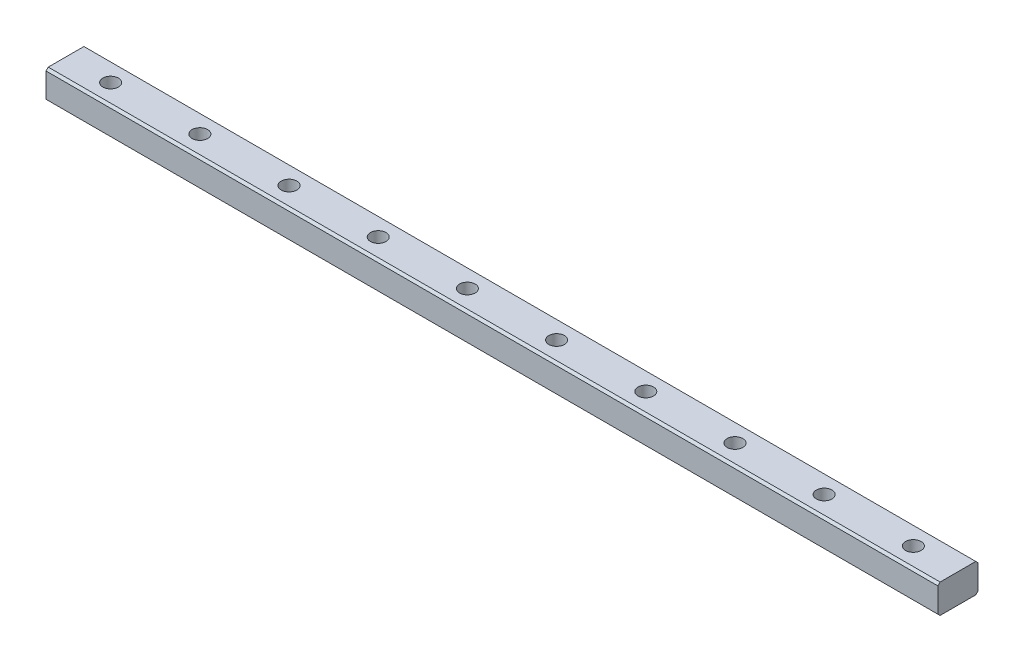
ISO-10303-21;
HEADER;
FILE_DESCRIPTION(('STEP AP214'),'2;1');
FILE_NAME('part.step','',(''),(''),'','','');
FILE_SCHEMA(('AUTOMOTIVE_DESIGN { 1 0 10303 214 1 1 1 1 }'));
ENDSEC;
DATA;
#1=APPLICATION_CONTEXT('core data for automotive mechanical design processes');
#2=APPLICATION_PROTOCOL_DEFINITION('international standard','automotive_design',2000,#1);
#3=PRODUCT_CONTEXT('',#1,'mechanical');
#4=PRODUCT('Part','Part','',(#3));
#5=PRODUCT_RELATED_PRODUCT_CATEGORY('part','',(#4));
#6=PRODUCT_DEFINITION_FORMATION('','',#4);
#7=PRODUCT_DEFINITION_CONTEXT('part definition',#1,'design');
#8=PRODUCT_DEFINITION('design','',#6,#7);
#9=PRODUCT_DEFINITION_SHAPE('','',#8);
#10=(LENGTH_UNIT() NAMED_UNIT(*) SI_UNIT(.MILLI.,.METRE.));
#11=(NAMED_UNIT(*) PLANE_ANGLE_UNIT() SI_UNIT($,.RADIAN.));
#12=(NAMED_UNIT(*) SI_UNIT($,.STERADIAN.) SOLID_ANGLE_UNIT());
#13=UNCERTAINTY_MEASURE_WITH_UNIT(LENGTH_MEASURE(1.E-05),#10,'distance_accuracy_value','');
#14=(GEOMETRIC_REPRESENTATION_CONTEXT(3) GLOBAL_UNCERTAINTY_ASSIGNED_CONTEXT((#13)) GLOBAL_UNIT_ASSIGNED_CONTEXT((#10,
#11,#12)) REPRESENTATION_CONTEXT('',''));
#15=CARTESIAN_POINT('',(0.,0.,0.));
#16=DIRECTION('',(0.,0.,1.));
#17=DIRECTION('',(1.,0.,0.));
#18=AXIS2_PLACEMENT_3D('',#15,#16,#17);
#19=CARTESIAN_POINT('',(149.999999999999,4.75,0.));
#20=DIRECTION('',(0.,-1.,0.));
#21=DIRECTION('',(0.,0.,-1.));
#22=AXIS2_PLACEMENT_3D('',#19,#20,#21);
#23=CYLINDRICAL_SURFACE('',#22,1.74999999999998);
#24=CARTESIAN_POINT('',(149.999999999999,3.25,0.));
#25=DIRECTION('',(0.,-1.,0.));
#26=DIRECTION('',(0.,0.,-1.));
#27=AXIS2_PLACEMENT_3D('',#24,#25,#26);
#28=CIRCLE('',#27,1.74999999999998);
#29=CARTESIAN_POINT('',(149.999999999999,3.25,-1.74999999999998));
#30=VERTEX_POINT('',#29);
#31=EDGE_CURVE('E169',#30,#30,#28,.T.);
#32=ORIENTED_EDGE('',*,*,#31,.F.);
#33=EDGE_LOOP('',(#32));
#34=FACE_BOUND('',#33,.T.);
#35=CARTESIAN_POINT('',(149.999999999999,0.25,0.));
#36=DIRECTION('',(0.,-1.,0.));
#37=DIRECTION('',(0.,0.,-1.));
#38=AXIS2_PLACEMENT_3D('',#35,#36,#37);
#39=CIRCLE('',#38,1.74999999999998);
#40=CARTESIAN_POINT('',(149.999999999999,0.25,-1.74999999999998));
#41=VERTEX_POINT('',#40);
#42=EDGE_CURVE('E216',#41,#41,#39,.F.);
#43=ORIENTED_EDGE('',*,*,#42,.F.);
#44=EDGE_LOOP('',(#43));
#45=FACE_BOUND('',#44,.T.);
#46=ADVANCED_FACE('F39',(#34,#45),#23,.F.);
#47=CARTESIAN_POINT('',(129.999999999999,4.75,0.));
#48=DIRECTION('',(0.,-1.,0.));
#49=DIRECTION('',(0.,0.,-1.));
#50=AXIS2_PLACEMENT_3D('',#47,#48,#49);
#51=CYLINDRICAL_SURFACE('',#50,1.74999999999998);
#52=CARTESIAN_POINT('',(129.999999999999,3.25,0.));
#53=DIRECTION('',(0.,-1.,0.));
#54=DIRECTION('',(0.,0.,-1.));
#55=AXIS2_PLACEMENT_3D('',#52,#53,#54);
#56=CIRCLE('',#55,1.74999999999998);
#57=CARTESIAN_POINT('',(129.999999999999,3.25,-1.74999999999998));
#58=VERTEX_POINT('',#57);
#59=EDGE_CURVE('E166',#58,#58,#56,.T.);
#60=ORIENTED_EDGE('',*,*,#59,.F.);
#61=EDGE_LOOP('',(#60));
#62=FACE_BOUND('',#61,.T.);
#63=CARTESIAN_POINT('',(129.999999999999,0.25,0.));
#64=DIRECTION('',(0.,-1.,0.));
#65=DIRECTION('',(0.,0.,-1.));
#66=AXIS2_PLACEMENT_3D('',#63,#64,#65);
#67=CIRCLE('',#66,1.74999999999998);
#68=CARTESIAN_POINT('',(129.999999999999,0.25,-1.74999999999998));
#69=VERTEX_POINT('',#68);
#70=EDGE_CURVE('E211',#69,#69,#67,.F.);
#71=ORIENTED_EDGE('',*,*,#70,.F.);
#72=EDGE_LOOP('',(#71));
#73=FACE_BOUND('',#72,.T.);
#74=ADVANCED_FACE('F351',(#62,#73),#51,.F.);
#75=CARTESIAN_POINT('',(110.,4.75,0.));
#76=DIRECTION('',(0.,-1.,0.));
#77=DIRECTION('',(0.,0.,-1.));
#78=AXIS2_PLACEMENT_3D('',#75,#76,#77);
#79=CYLINDRICAL_SURFACE('',#78,1.75);
#80=CARTESIAN_POINT('',(110.,3.25,0.));
#81=DIRECTION('',(0.,-1.,0.));
#82=DIRECTION('',(0.,0.,-1.));
#83=AXIS2_PLACEMENT_3D('',#80,#81,#82);
#84=CIRCLE('',#83,1.75);
#85=CARTESIAN_POINT('',(110.,3.25,-1.75));
#86=VERTEX_POINT('',#85);
#87=EDGE_CURVE('E163',#86,#86,#84,.T.);
#88=ORIENTED_EDGE('',*,*,#87,.F.);
#89=EDGE_LOOP('',(#88));
#90=FACE_BOUND('',#89,.T.);
#91=CARTESIAN_POINT('',(110.,0.25,0.));
#92=DIRECTION('',(0.,-1.,0.));
#93=DIRECTION('',(0.,0.,-1.));
#94=AXIS2_PLACEMENT_3D('',#91,#92,#93);
#95=CIRCLE('',#94,1.75);
#96=CARTESIAN_POINT('',(110.,0.25,-1.75));
#97=VERTEX_POINT('',#96);
#98=EDGE_CURVE('E206',#97,#97,#95,.F.);
#99=ORIENTED_EDGE('',*,*,#98,.F.);
#100=EDGE_LOOP('',(#99));
#101=FACE_BOUND('',#100,.T.);
#102=ADVANCED_FACE('F356',(#90,#101),#79,.F.);
#103=CARTESIAN_POINT('',(89.9999999999996,4.75,0.));
#104=DIRECTION('',(0.,-1.,0.));
#105=DIRECTION('',(0.,0.,-1.));
#106=AXIS2_PLACEMENT_3D('',#103,#104,#105);
#107=CYLINDRICAL_SURFACE('',#106,1.75);
#108=CARTESIAN_POINT('',(89.9999999999996,3.25,0.));
#109=DIRECTION('',(0.,-1.,0.));
#110=DIRECTION('',(0.,0.,-1.));
#111=AXIS2_PLACEMENT_3D('',#108,#109,#110);
#112=CIRCLE('',#111,1.75);
#113=CARTESIAN_POINT('',(89.9999999999996,3.25,-1.75));
#114=VERTEX_POINT('',#113);
#115=EDGE_CURVE('E160',#114,#114,#112,.T.);
#116=ORIENTED_EDGE('',*,*,#115,.F.);
#117=EDGE_LOOP('',(#116));
#118=FACE_BOUND('',#117,.T.);
#119=CARTESIAN_POINT('',(89.9999999999996,0.25,0.));
#120=DIRECTION('',(0.,-1.,0.));
#121=DIRECTION('',(0.,0.,-1.));
#122=AXIS2_PLACEMENT_3D('',#119,#120,#121);
#123=CIRCLE('',#122,1.75);
#124=CARTESIAN_POINT('',(89.9999999999996,0.25,-1.75));
#125=VERTEX_POINT('',#124);
#126=EDGE_CURVE('E201',#125,#125,#123,.F.);
#127=ORIENTED_EDGE('',*,*,#126,.F.);
#128=EDGE_LOOP('',(#127));
#129=FACE_BOUND('',#128,.T.);
#130=ADVANCED_FACE('F364',(#118,#129),#107,.F.);
#131=CARTESIAN_POINT('',(69.9999999999997,4.75,0.));
#132=DIRECTION('',(0.,-1.,0.));
#133=DIRECTION('',(0.,0.,-1.));
#134=AXIS2_PLACEMENT_3D('',#131,#132,#133);
#135=CYLINDRICAL_SURFACE('',#134,1.75);
#136=CARTESIAN_POINT('',(69.9999999999997,3.25,0.));
#137=DIRECTION('',(0.,-1.,0.));
#138=DIRECTION('',(0.,0.,-1.));
#139=AXIS2_PLACEMENT_3D('',#136,#137,#138);
#140=CIRCLE('',#139,1.75);
#141=CARTESIAN_POINT('',(69.9999999999997,3.25,-1.75));
#142=VERTEX_POINT('',#141);
#143=EDGE_CURVE('E157',#142,#142,#140,.T.);
#144=ORIENTED_EDGE('',*,*,#143,.F.);
#145=EDGE_LOOP('',(#144));
#146=FACE_BOUND('',#145,.T.);
#147=CARTESIAN_POINT('',(69.9999999999997,0.25,0.));
#148=DIRECTION('',(0.,-1.,0.));
#149=DIRECTION('',(0.,0.,-1.));
#150=AXIS2_PLACEMENT_3D('',#147,#148,#149);
#151=CIRCLE('',#150,1.75);
#152=CARTESIAN_POINT('',(69.9999999999997,0.25,-1.75));
#153=VERTEX_POINT('',#152);
#154=EDGE_CURVE('E196',#153,#153,#151,.F.);
#155=ORIENTED_EDGE('',*,*,#154,.F.);
#156=EDGE_LOOP('',(#155));
#157=FACE_BOUND('',#156,.T.);
#158=ADVANCED_FACE('F368',(#146,#157),#135,.F.);
#159=CARTESIAN_POINT('',(49.9999999999998,4.75,0.));
#160=DIRECTION('',(0.,-1.,0.));
#161=DIRECTION('',(0.,0.,-1.));
#162=AXIS2_PLACEMENT_3D('',#159,#160,#161);
#163=CYLINDRICAL_SURFACE('',#162,1.75);
#164=CARTESIAN_POINT('',(49.9999999999998,3.25,0.));
#165=DIRECTION('',(0.,-1.,0.));
#166=DIRECTION('',(0.,0.,-1.));
#167=AXIS2_PLACEMENT_3D('',#164,#165,#166);
#168=CIRCLE('',#167,1.75);
#169=CARTESIAN_POINT('',(49.9999999999998,3.25,-1.75000000000001));
#170=VERTEX_POINT('',#169);
#171=EDGE_CURVE('E154',#170,#170,#168,.T.);
#172=ORIENTED_EDGE('',*,*,#171,.F.);
#173=EDGE_LOOP('',(#172));
#174=FACE_BOUND('',#173,.T.);
#175=CARTESIAN_POINT('',(49.9999999999998,0.25,0.));
#176=DIRECTION('',(0.,-1.,0.));
#177=DIRECTION('',(0.,0.,-1.));
#178=AXIS2_PLACEMENT_3D('',#175,#176,#177);
#179=CIRCLE('',#178,1.75);
#180=CARTESIAN_POINT('',(49.9999999999998,0.25,-1.75000000000001));
#181=VERTEX_POINT('',#180);
#182=EDGE_CURVE('E191',#181,#181,#179,.F.);
#183=ORIENTED_EDGE('',*,*,#182,.F.);
#184=EDGE_LOOP('',(#183));
#185=FACE_BOUND('',#184,.T.);
#186=ADVANCED_FACE('F372',(#174,#185),#163,.F.);
#187=CARTESIAN_POINT('',(29.9999999999999,4.75,0.));
#188=DIRECTION('',(0.,-1.,0.));
#189=DIRECTION('',(0.,0.,-1.));
#190=AXIS2_PLACEMENT_3D('',#187,#188,#189);
#191=CYLINDRICAL_SURFACE('',#190,1.75);
#192=CARTESIAN_POINT('',(29.9999999999999,3.25,0.));
#193=DIRECTION('',(0.,-1.,0.));
#194=DIRECTION('',(0.,0.,-1.));
#195=AXIS2_PLACEMENT_3D('',#192,#193,#194);
#196=CIRCLE('',#195,1.75);
#197=CARTESIAN_POINT('',(29.9999999999999,3.25,-1.75000000000001));
#198=VERTEX_POINT('',#197);
#199=EDGE_CURVE('E151',#198,#198,#196,.T.);
#200=ORIENTED_EDGE('',*,*,#199,.F.);
#201=EDGE_LOOP('',(#200));
#202=FACE_BOUND('',#201,.T.);
#203=CARTESIAN_POINT('',(29.9999999999999,0.25,0.));
#204=DIRECTION('',(0.,-1.,0.));
#205=DIRECTION('',(0.,0.,-1.));
#206=AXIS2_PLACEMENT_3D('',#203,#204,#205);
#207=CIRCLE('',#206,1.75);
#208=CARTESIAN_POINT('',(29.9999999999999,0.25,-1.75000000000001));
#209=VERTEX_POINT('',#208);
#210=EDGE_CURVE('E186',#209,#209,#207,.F.);
#211=ORIENTED_EDGE('',*,*,#210,.F.);
#212=EDGE_LOOP('',(#211));
#213=FACE_BOUND('',#212,.T.);
#214=ADVANCED_FACE('F376',(#202,#213),#191,.F.);
#215=CARTESIAN_POINT('',(189.999999999999,4.75,0.));
#216=DIRECTION('',(0.,-1.,0.));
#217=DIRECTION('',(0.,0.,-1.));
#218=AXIS2_PLACEMENT_3D('',#215,#216,#217);
#219=CYLINDRICAL_SURFACE('',#218,1.74999999999998);
#220=CARTESIAN_POINT('',(189.999999999999,3.25,0.));
#221=DIRECTION('',(0.,-1.,0.));
#222=DIRECTION('',(0.,0.,-1.));
#223=AXIS2_PLACEMENT_3D('',#220,#221,#222);
#224=CIRCLE('',#223,1.74999999999998);
#225=CARTESIAN_POINT('',(189.999999999999,3.25,-1.74999999999998));
#226=VERTEX_POINT('',#225);
#227=EDGE_CURVE('E148',#226,#226,#224,.T.);
#228=ORIENTED_EDGE('',*,*,#227,.F.);
#229=EDGE_LOOP('',(#228));
#230=FACE_BOUND('',#229,.T.);
#231=CARTESIAN_POINT('',(189.999999999999,0.25,0.));
#232=DIRECTION('',(0.,-1.,0.));
#233=DIRECTION('',(0.,0.,-1.));
#234=AXIS2_PLACEMENT_3D('',#231,#232,#233);
#235=CIRCLE('',#234,1.74999999999998);
#236=CARTESIAN_POINT('',(189.999999999999,0.25,-1.74999999999998));
#237=VERTEX_POINT('',#236);
#238=EDGE_CURVE('E181',#237,#237,#235,.F.);
#239=ORIENTED_EDGE('',*,*,#238,.F.);
#240=EDGE_LOOP('',(#239));
#241=FACE_BOUND('',#240,.T.);
#242=ADVANCED_FACE('F380',(#230,#241),#219,.F.);
#243=CARTESIAN_POINT('',(169.999999999999,4.75,0.));
#244=DIRECTION('',(0.,-1.,0.));
#245=DIRECTION('',(0.,0.,-1.));
#246=AXIS2_PLACEMENT_3D('',#243,#244,#245);
#247=CYLINDRICAL_SURFACE('',#246,1.74999999999998);
#248=CARTESIAN_POINT('',(169.999999999999,3.25,0.));
#249=DIRECTION('',(0.,-1.,0.));
#250=DIRECTION('',(0.,0.,-1.));
#251=AXIS2_PLACEMENT_3D('',#248,#249,#250);
#252=CIRCLE('',#251,1.74999999999998);
#253=CARTESIAN_POINT('',(169.999999999999,3.25,-1.74999999999998));
#254=VERTEX_POINT('',#253);
#255=EDGE_CURVE('E145',#254,#254,#252,.T.);
#256=ORIENTED_EDGE('',*,*,#255,.F.);
#257=EDGE_LOOP('',(#256));
#258=FACE_BOUND('',#257,.T.);
#259=CARTESIAN_POINT('',(169.999999999999,0.25,0.));
#260=DIRECTION('',(0.,-1.,0.));
#261=DIRECTION('',(0.,0.,-1.));
#262=AXIS2_PLACEMENT_3D('',#259,#260,#261);
#263=CIRCLE('',#262,1.74999999999998);
#264=CARTESIAN_POINT('',(169.999999999999,0.25,-1.74999999999998));
#265=VERTEX_POINT('',#264);
#266=EDGE_CURVE('E176',#265,#265,#263,.F.);
#267=ORIENTED_EDGE('',*,*,#266,.F.);
#268=EDGE_LOOP('',(#267));
#269=FACE_BOUND('',#268,.T.);
#270=ADVANCED_FACE('F384',(#258,#269),#247,.F.);
#271=CARTESIAN_POINT('',(10.,4.75,0.));
#272=DIRECTION('',(0.,-1.,0.));
#273=DIRECTION('',(0.,0.,-1.));
#274=AXIS2_PLACEMENT_3D('',#271,#272,#273);
#275=CYLINDRICAL_SURFACE('',#274,1.75);
#276=CARTESIAN_POINT('',(10.,3.25,0.));
#277=DIRECTION('',(0.,-1.,0.));
#278=DIRECTION('',(0.,0.,-1.));
#279=AXIS2_PLACEMENT_3D('',#276,#277,#278);
#280=CIRCLE('',#279,1.75);
#281=CARTESIAN_POINT('',(10.,3.25,-1.75));
#282=VERTEX_POINT('',#281);
#283=EDGE_CURVE('E137',#282,#282,#280,.T.);
#284=ORIENTED_EDGE('',*,*,#283,.F.);
#285=EDGE_LOOP('',(#284));
#286=FACE_BOUND('',#285,.T.);
#287=CARTESIAN_POINT('',(10.,0.25,0.));
#288=DIRECTION('',(0.,-1.,0.));
#289=DIRECTION('',(0.,0.,-1.));
#290=AXIS2_PLACEMENT_3D('',#287,#288,#289);
#291=CIRCLE('',#290,1.75);
#292=CARTESIAN_POINT('',(10.,0.25,-1.75));
#293=VERTEX_POINT('',#292);
#294=EDGE_CURVE('E172',#293,#293,#291,.F.);
#295=ORIENTED_EDGE('',*,*,#294,.F.);
#296=EDGE_LOOP('',(#295));
#297=FACE_BOUND('',#296,.T.);
#298=ADVANCED_FACE('F388',(#286,#297),#275,.F.);
#299=CARTESIAN_POINT('',(200.,-3.25,4.5));
#300=DIRECTION('',(0.,0.,-1.));
#301=DIRECTION('',(-1.,0.,0.));
#302=AXIS2_PLACEMENT_3D('',#299,#300,#301);
#303=PLANE('',#302);
#304=DIRECTION('',(0.,-1.,0.));
#305=VECTOR('',#304,1.);
#306=CARTESIAN_POINT('',(0.,-3.25,4.5));
#307=LINE('',#306,#305);
#308=CARTESIAN_POINT('',(0.,2.75000000000003,4.5));
#309=VERTEX_POINT('',#308);
#310=CARTESIAN_POINT('',(0.,-2.75,4.5));
#311=VERTEX_POINT('',#310);
#312=EDGE_CURVE('E132',#309,#311,#307,.T.);
#313=ORIENTED_EDGE('',*,*,#312,.T.);
#314=DIRECTION('',(1.,0.,0.));
#315=VECTOR('',#314,1.);
#316=CARTESIAN_POINT('',(200.,-2.75,4.5));
#317=LINE('',#316,#315);
#318=CARTESIAN_POINT('',(200.,-2.75,4.5));
#319=VERTEX_POINT('',#318);
#320=EDGE_CURVE('E110',#311,#319,#317,.T.);
#321=ORIENTED_EDGE('',*,*,#320,.T.);
#322=DIRECTION('',(0.,-1.,0.));
#323=VECTOR('',#322,1.);
#324=CARTESIAN_POINT('',(200.,-3.25,4.5));
#325=LINE('',#324,#323);
#326=CARTESIAN_POINT('',(200.,2.75000000000003,4.5));
#327=VERTEX_POINT('',#326);
#328=EDGE_CURVE('E142',#327,#319,#325,.T.);
#329=ORIENTED_EDGE('',*,*,#328,.F.);
#330=DIRECTION('',(-1.,0.,0.));
#331=VECTOR('',#330,1.);
#332=CARTESIAN_POINT('',(200.,2.75000000000003,4.5));
#333=LINE('',#332,#331);
#334=EDGE_CURVE('E115',#327,#309,#333,.T.);
#335=ORIENTED_EDGE('',*,*,#334,.T.);
#336=EDGE_LOOP('',(#313,#321,#329,#335));
#337=FACE_BOUND('',#336,.T.);
#338=ADVANCED_FACE('F313',(#337),#303,.F.);
#339=CARTESIAN_POINT('',(200.,-3.25,-4.5));
#340=DIRECTION('',(0.,1.,0.));
#341=DIRECTION('',(0.,0.,1.));
#342=AXIS2_PLACEMENT_3D('',#339,#340,#341);
#343=PLANE('',#342);
#344=CARTESIAN_POINT('',(150.,-3.25,0.));
#345=DIRECTION('',(0.,-1.,0.));
#346=DIRECTION('',(0.,0.,-1.));
#347=AXIS2_PLACEMENT_3D('',#344,#345,#346);
#348=CIRCLE('',#347,2.99999999999999);
#349=CARTESIAN_POINT('',(150.,-3.25,-3.));
#350=VERTEX_POINT('',#349);
#351=EDGE_CURVE('E296',#350,#350,#348,.T.);
#352=ORIENTED_EDGE('',*,*,#351,.F.);
#353=EDGE_LOOP('',(#352));
#354=FACE_BOUND('',#353,.T.);
#355=CARTESIAN_POINT('',(130.,-3.25,0.));
#356=DIRECTION('',(0.,-1.,0.));
#357=DIRECTION('',(0.,0.,-1.));
#358=AXIS2_PLACEMENT_3D('',#355,#356,#357);
#359=CIRCLE('',#358,2.99999999999999);
#360=CARTESIAN_POINT('',(130.,-3.25,-3.));
#361=VERTEX_POINT('',#360);
#362=EDGE_CURVE('E219',#361,#361,#359,.T.);
#363=ORIENTED_EDGE('',*,*,#362,.F.);
#364=EDGE_LOOP('',(#363));
#365=FACE_BOUND('',#364,.T.);
#366=CARTESIAN_POINT('',(110.,-3.25,0.));
#367=DIRECTION('',(0.,-1.,0.));
#368=DIRECTION('',(0.,0.,-1.));
#369=AXIS2_PLACEMENT_3D('',#366,#367,#368);
#370=CIRCLE('',#369,2.99999999999999);
#371=CARTESIAN_POINT('',(110.,-3.25,-2.99999999999999));
#372=VERTEX_POINT('',#371);
#373=EDGE_CURVE('E214',#372,#372,#370,.T.);
#374=ORIENTED_EDGE('',*,*,#373,.F.);
#375=EDGE_LOOP('',(#374));
#376=FACE_BOUND('',#375,.T.);
#377=CARTESIAN_POINT('',(90.,-3.25,0.));
#378=DIRECTION('',(0.,-1.,0.));
#379=DIRECTION('',(0.,0.,-1.));
#380=AXIS2_PLACEMENT_3D('',#377,#378,#379);
#381=CIRCLE('',#380,3.00000000000001);
#382=CARTESIAN_POINT('',(90.,-3.25,-3.00000000000001));
#383=VERTEX_POINT('',#382);
#384=EDGE_CURVE('E209',#383,#383,#381,.T.);
#385=ORIENTED_EDGE('',*,*,#384,.F.);
#386=EDGE_LOOP('',(#385));
#387=FACE_BOUND('',#386,.T.);
#388=CARTESIAN_POINT('',(70.,-3.25,0.));
#389=DIRECTION('',(0.,-1.,0.));
#390=DIRECTION('',(0.,0.,-1.));
#391=AXIS2_PLACEMENT_3D('',#388,#389,#390);
#392=CIRCLE('',#391,2.99999999999999);
#393=CARTESIAN_POINT('',(70.,-3.25,-2.99999999999999));
#394=VERTEX_POINT('',#393);
#395=EDGE_CURVE('E204',#394,#394,#392,.T.);
#396=ORIENTED_EDGE('',*,*,#395,.F.);
#397=EDGE_LOOP('',(#396));
#398=FACE_BOUND('',#397,.T.);
#399=CARTESIAN_POINT('',(50.,-3.25,0.));
#400=DIRECTION('',(0.,-1.,0.));
#401=DIRECTION('',(0.,0.,-1.));
#402=AXIS2_PLACEMENT_3D('',#399,#400,#401);
#403=CIRCLE('',#402,3.);
#404=CARTESIAN_POINT('',(50.,-3.25,-3.));
#405=VERTEX_POINT('',#404);
#406=EDGE_CURVE('E199',#405,#405,#403,.T.);
#407=ORIENTED_EDGE('',*,*,#406,.F.);
#408=EDGE_LOOP('',(#407));
#409=FACE_BOUND('',#408,.T.);
#410=CARTESIAN_POINT('',(30.,-3.25,0.));
#411=DIRECTION('',(0.,-1.,0.));
#412=DIRECTION('',(0.,0.,-1.));
#413=AXIS2_PLACEMENT_3D('',#410,#411,#412);
#414=CIRCLE('',#413,3.);
#415=CARTESIAN_POINT('',(30.,-3.25,-3.));
#416=VERTEX_POINT('',#415);
#417=EDGE_CURVE('E194',#416,#416,#414,.T.);
#418=ORIENTED_EDGE('',*,*,#417,.F.);
#419=EDGE_LOOP('',(#418));
#420=FACE_BOUND('',#419,.T.);
#421=CARTESIAN_POINT('',(190.,-3.25,0.));
#422=DIRECTION('',(0.,-1.,0.));
#423=DIRECTION('',(0.,0.,-1.));
#424=AXIS2_PLACEMENT_3D('',#421,#422,#423);
#425=CIRCLE('',#424,2.99999999999999);
#426=CARTESIAN_POINT('',(190.,-3.25,-3.));
#427=VERTEX_POINT('',#426);
#428=EDGE_CURVE('E189',#427,#427,#425,.T.);
#429=ORIENTED_EDGE('',*,*,#428,.F.);
#430=EDGE_LOOP('',(#429));
#431=FACE_BOUND('',#430,.T.);
#432=CARTESIAN_POINT('',(170.,-3.25,0.));
#433=DIRECTION('',(0.,-1.,0.));
#434=DIRECTION('',(0.,0.,-1.));
#435=AXIS2_PLACEMENT_3D('',#432,#433,#434);
#436=CIRCLE('',#435,2.99999999999999);
#437=CARTESIAN_POINT('',(170.,-3.25,-3.));
#438=VERTEX_POINT('',#437);
#439=EDGE_CURVE('E184',#438,#438,#436,.T.);
#440=ORIENTED_EDGE('',*,*,#439,.F.);
#441=EDGE_LOOP('',(#440));
#442=FACE_BOUND('',#441,.T.);
#443=CARTESIAN_POINT('',(10.,-3.25,0.));
#444=DIRECTION('',(0.,-1.,0.));
#445=DIRECTION('',(0.,0.,-1.));
#446=AXIS2_PLACEMENT_3D('',#443,#444,#445);
#447=CIRCLE('',#446,3.);
#448=CARTESIAN_POINT('',(10.,-3.25,-3.));
#449=VERTEX_POINT('',#448);
#450=EDGE_CURVE('E179',#449,#449,#447,.T.);
#451=ORIENTED_EDGE('',*,*,#450,.F.);
#452=EDGE_LOOP('',(#451));
#453=FACE_BOUND('',#452,.T.);
#454=DIRECTION('',(0.,0.,-1.));
#455=VECTOR('',#454,1.);
#456=CARTESIAN_POINT('',(200.,-3.25,-4.5));
#457=LINE('',#456,#455);
#458=CARTESIAN_POINT('',(200.,-3.25,3.99999999999997));
#459=VERTEX_POINT('',#458);
#460=CARTESIAN_POINT('',(200.,-3.25,-4.));
#461=VERTEX_POINT('',#460);
#462=EDGE_CURVE('E125',#459,#461,#457,.T.);
#463=ORIENTED_EDGE('',*,*,#462,.F.);
#464=DIRECTION('',(-1.,0.,0.));
#465=VECTOR('',#464,1.);
#466=CARTESIAN_POINT('',(200.,-3.25,3.99999999999997));
#467=LINE('',#466,#465);
#468=CARTESIAN_POINT('',(0.,-3.25,3.99999999999997));
#469=VERTEX_POINT('',#468);
#470=EDGE_CURVE('E109',#459,#469,#467,.T.);
#471=ORIENTED_EDGE('',*,*,#470,.T.);
#472=DIRECTION('',(0.,0.,-1.));
#473=VECTOR('',#472,1.);
#474=CARTESIAN_POINT('',(0.,-3.25,-4.5));
#475=LINE('',#474,#473);
#476=CARTESIAN_POINT('',(0.,-3.25,-4.));
#477=VERTEX_POINT('',#476);
#478=EDGE_CURVE('E122',#469,#477,#475,.T.);
#479=ORIENTED_EDGE('',*,*,#478,.T.);
#480=DIRECTION('',(1.,0.,0.));
#481=VECTOR('',#480,1.);
#482=CARTESIAN_POINT('',(200.,-3.25,-4.));
#483=LINE('',#482,#481);
#484=EDGE_CURVE('E127',#477,#461,#483,.T.);
#485=ORIENTED_EDGE('',*,*,#484,.T.);
#486=EDGE_LOOP('',(#463,#471,#479,#485));
#487=FACE_BOUND('',#486,.T.);
#488=ADVANCED_FACE('F121',(#354,#365,#376,#387,#398,#409,#420,#431,#442,#453,#487),#343,.F.);
#489=CARTESIAN_POINT('',(200.,-3.25,-4.5));
#490=DIRECTION('',(0.,0.,1.));
#491=DIRECTION('',(1.,0.,0.));
#492=AXIS2_PLACEMENT_3D('',#489,#490,#491);
#493=PLANE('',#492);
#494=DIRECTION('',(0.,1.,0.));
#495=VECTOR('',#494,1.);
#496=CARTESIAN_POINT('',(0.,-3.25,-4.5));
#497=LINE('',#496,#495);
#498=CARTESIAN_POINT('',(0.,-2.75000000000003,-4.5));
#499=VERTEX_POINT('',#498);
#500=CARTESIAN_POINT('',(0.,2.75000000000003,-4.5));
#501=VERTEX_POINT('',#500);
#502=EDGE_CURVE('E131',#499,#501,#497,.T.);
#503=ORIENTED_EDGE('',*,*,#502,.T.);
#504=DIRECTION('',(1.,0.,0.));
#505=VECTOR('',#504,1.);
#506=CARTESIAN_POINT('',(200.,2.75000000000003,-4.5));
#507=LINE('',#506,#505);
#508=CARTESIAN_POINT('',(200.,2.75000000000003,-4.5));
#509=VERTEX_POINT('',#508);
#510=EDGE_CURVE('E11',#501,#509,#507,.T.);
#511=ORIENTED_EDGE('',*,*,#510,.T.);
#512=DIRECTION('',(0.,1.,0.));
#513=VECTOR('',#512,1.);
#514=CARTESIAN_POINT('',(200.,-3.25,-4.5));
#515=LINE('',#514,#513);
#516=CARTESIAN_POINT('',(200.,-2.75000000000003,-4.5));
#517=VERTEX_POINT('',#516);
#518=EDGE_CURVE('E246',#517,#509,#515,.T.);
#519=ORIENTED_EDGE('',*,*,#518,.F.);
#520=DIRECTION('',(-1.,0.,0.));
#521=VECTOR('',#520,1.);
#522=CARTESIAN_POINT('',(200.,-2.75000000000003,-4.5));
#523=LINE('',#522,#521);
#524=EDGE_CURVE('E47',#517,#499,#523,.T.);
#525=ORIENTED_EDGE('',*,*,#524,.T.);
#526=EDGE_LOOP('',(#503,#511,#519,#525));
#527=FACE_BOUND('',#526,.T.);
#528=ADVANCED_FACE('F244',(#527),#493,.F.);
#529=CARTESIAN_POINT('',(200.,3.25,-4.5));
#530=DIRECTION('',(0.,-1.,0.));
#531=DIRECTION('',(0.,0.,-1.));
#532=AXIS2_PLACEMENT_3D('',#529,#530,#531);
#533=PLANE('',#532);
#534=ORIENTED_EDGE('',*,*,#31,.T.);
#535=EDGE_LOOP('',(#534));
#536=FACE_BOUND('',#535,.T.);
#537=ORIENTED_EDGE('',*,*,#59,.T.);
#538=EDGE_LOOP('',(#537));
#539=FACE_BOUND('',#538,.T.);
#540=ORIENTED_EDGE('',*,*,#87,.T.);
#541=EDGE_LOOP('',(#540));
#542=FACE_BOUND('',#541,.T.);
#543=ORIENTED_EDGE('',*,*,#115,.T.);
#544=EDGE_LOOP('',(#543));
#545=FACE_BOUND('',#544,.T.);
#546=ORIENTED_EDGE('',*,*,#143,.T.);
#547=EDGE_LOOP('',(#546));
#548=FACE_BOUND('',#547,.T.);
#549=ORIENTED_EDGE('',*,*,#171,.T.);
#550=EDGE_LOOP('',(#549));
#551=FACE_BOUND('',#550,.T.);
#552=ORIENTED_EDGE('',*,*,#199,.T.);
#553=EDGE_LOOP('',(#552));
#554=FACE_BOUND('',#553,.T.);
#555=ORIENTED_EDGE('',*,*,#227,.T.);
#556=EDGE_LOOP('',(#555));
#557=FACE_BOUND('',#556,.T.);
#558=ORIENTED_EDGE('',*,*,#255,.T.);
#559=EDGE_LOOP('',(#558));
#560=FACE_BOUND('',#559,.T.);
#561=ORIENTED_EDGE('',*,*,#283,.T.);
#562=EDGE_LOOP('',(#561));
#563=FACE_BOUND('',#562,.T.);
#564=DIRECTION('',(0.,0.,1.));
#565=VECTOR('',#564,1.);
#566=CARTESIAN_POINT('',(0.,3.25,-4.5));
#567=LINE('',#566,#565);
#568=CARTESIAN_POINT('',(0.,3.25,-4.00000000000003));
#569=VERTEX_POINT('',#568);
#570=CARTESIAN_POINT('',(0.,3.25,4.));
#571=VERTEX_POINT('',#570);
#572=EDGE_CURVE('E135',#569,#571,#567,.T.);
#573=ORIENTED_EDGE('',*,*,#572,.T.);
#574=DIRECTION('',(1.,0.,0.));
#575=VECTOR('',#574,1.);
#576=CARTESIAN_POINT('',(200.,3.25,4.));
#577=LINE('',#576,#575);
#578=CARTESIAN_POINT('',(200.,3.25,4.));
#579=VERTEX_POINT('',#578);
#580=EDGE_CURVE('E54',#571,#579,#577,.T.);
#581=ORIENTED_EDGE('',*,*,#580,.T.);
#582=DIRECTION('',(0.,0.,1.));
#583=VECTOR('',#582,1.);
#584=CARTESIAN_POINT('',(200.,3.25,-4.5));
#585=LINE('',#584,#583);
#586=CARTESIAN_POINT('',(200.,3.25,-4.00000000000003));
#587=VERTEX_POINT('',#586);
#588=EDGE_CURVE('E221',#587,#579,#585,.T.);
#589=ORIENTED_EDGE('',*,*,#588,.F.);
#590=DIRECTION('',(-1.,0.,0.));
#591=VECTOR('',#590,1.);
#592=CARTESIAN_POINT('',(200.,3.25,-4.00000000000003));
#593=LINE('',#592,#591);
#594=EDGE_CURVE('E237',#587,#569,#593,.T.);
#595=ORIENTED_EDGE('',*,*,#594,.T.);
#596=EDGE_LOOP('',(#573,#581,#589,#595));
#597=FACE_BOUND('',#596,.T.);
#598=ADVANCED_FACE('F253',(#536,#539,#542,#545,#548,#551,#554,#557,#560,#563,#597),#533,.F.);
#599=CARTESIAN_POINT('',(200.,3.25,4.5));
#600=DIRECTION('',(1.,0.,0.));
#601=DIRECTION('',(0.,0.,-1.));
#602=AXIS2_PLACEMENT_3D('',#599,#600,#601);
#603=PLANE('',#602);
#604=ORIENTED_EDGE('',*,*,#328,.T.);
#605=DIRECTION('',(0.,0.707106781186528,0.707106781186567));
#606=VECTOR('',#605,1.);
#607=CARTESIAN_POINT('',(200.,0.249999999999834,7.5));
#608=LINE('',#607,#606);
#609=EDGE_CURVE('E235',#319,#459,#608,.F.);
#610=ORIENTED_EDGE('',*,*,#609,.T.);
#611=ORIENTED_EDGE('',*,*,#462,.T.);
#612=DIRECTION('',(0.,-0.707106781186528,0.707106781186567));
#613=VECTOR('',#612,1.);
#614=CARTESIAN_POINT('',(200.,-4.25000000000018,-2.99999999999976));
#615=LINE('',#614,#613);
#616=EDGE_CURVE('E230',#461,#517,#615,.F.);
#617=ORIENTED_EDGE('',*,*,#616,.T.);
#618=ORIENTED_EDGE('',*,*,#518,.T.);
#619=DIRECTION('',(0.,-0.707106781186548,-0.707106781186548));
#620=VECTOR('',#619,1.);
#621=CARTESIAN_POINT('',(200.,7.50000000000001,0.249999999999985));
#622=LINE('',#621,#620);
#623=EDGE_CURVE('E61',#509,#587,#622,.F.);
#624=ORIENTED_EDGE('',*,*,#623,.T.);
#625=ORIENTED_EDGE('',*,*,#588,.T.);
#626=DIRECTION('',(0.,0.707106781186528,-0.707106781186567));
#627=VECTOR('',#626,1.);
#628=CARTESIAN_POINT('',(200.,3.,4.25000000000001));
#629=LINE('',#628,#627);
#630=EDGE_CURVE('E233',#579,#327,#629,.F.);
#631=ORIENTED_EDGE('',*,*,#630,.T.);
#632=EDGE_LOOP('',(#604,#610,#611,#617,#618,#624,#625,#631));
#633=FACE_BOUND('',#632,.T.);
#634=ADVANCED_FACE('F393',(#633),#603,.T.);
#635=CARTESIAN_POINT('',(0.,3.25,4.5));
#636=DIRECTION('',(1.,0.,0.));
#637=DIRECTION('',(0.,0.,-1.));
#638=AXIS2_PLACEMENT_3D('',#635,#636,#637);
#639=PLANE('',#638);
#640=ORIENTED_EDGE('',*,*,#478,.F.);
#641=DIRECTION('',(0.,-0.707106781186528,-0.707106781186567));
#642=VECTOR('',#641,1.);
#643=CARTESIAN_POINT('',(0.,-3.25,3.99999999999997));
#644=LINE('',#643,#642);
#645=EDGE_CURVE('E105',#469,#311,#644,.F.);
#646=ORIENTED_EDGE('',*,*,#645,.T.);
#647=ORIENTED_EDGE('',*,*,#312,.F.);
#648=DIRECTION('',(0.,-0.707106781186528,0.707106781186567));
#649=VECTOR('',#648,1.);
#650=CARTESIAN_POINT('',(0.,2.75000000000003,4.5));
#651=LINE('',#650,#649);
#652=EDGE_CURVE('E116',#309,#571,#651,.F.);
#653=ORIENTED_EDGE('',*,*,#652,.T.);
#654=ORIENTED_EDGE('',*,*,#572,.F.);
#655=DIRECTION('',(0.,0.707106781186548,0.707106781186548));
#656=VECTOR('',#655,1.);
#657=CARTESIAN_POINT('',(0.,3.25,-4.00000000000003));
#658=LINE('',#657,#656);
#659=EDGE_CURVE('E224',#569,#501,#658,.F.);
#660=ORIENTED_EDGE('',*,*,#659,.T.);
#661=ORIENTED_EDGE('',*,*,#502,.F.);
#662=DIRECTION('',(0.,0.707106781186528,-0.707106781186567));
#663=VECTOR('',#662,1.);
#664=CARTESIAN_POINT('',(0.,-2.75000000000003,-4.5));
#665=LINE('',#664,#663);
#666=EDGE_CURVE('E126',#499,#477,#665,.F.);
#667=ORIENTED_EDGE('',*,*,#666,.T.);
#668=EDGE_LOOP('',(#640,#646,#647,#653,#654,#660,#661,#667));
#669=FACE_BOUND('',#668,.T.);
#670=ADVANCED_FACE('F129',(#669),#639,.F.);
#671=CARTESIAN_POINT('',(10.,0.250000000000001,0.));
#672=DIRECTION('',(0.,-1.,0.));
#673=DIRECTION('',(0.,0.,-1.));
#674=AXIS2_PLACEMENT_3D('',#671,#672,#673);
#675=PLANE('',#674);
#676=CARTESIAN_POINT('',(10.,0.250000000000001,0.));
#677=DIRECTION('',(0.,-1.,0.));
#678=DIRECTION('',(0.,0.,-1.));
#679=AXIS2_PLACEMENT_3D('',#676,#677,#678);
#680=CIRCLE('',#679,3.);
#681=CARTESIAN_POINT('',(10.,0.25,-3.));
#682=VERTEX_POINT('',#681);
#683=EDGE_CURVE('E175',#682,#682,#680,.T.);
#684=ORIENTED_EDGE('',*,*,#683,.T.);
#685=EDGE_LOOP('',(#684));
#686=FACE_BOUND('',#685,.T.);
#687=ORIENTED_EDGE('',*,*,#294,.T.);
#688=EDGE_LOOP('',(#687));
#689=FACE_BOUND('',#688,.T.);
#690=ADVANCED_FACE('F336',(#686,#689),#675,.T.);
#691=CARTESIAN_POINT('',(10.,0.250000000000001,0.));
#692=DIRECTION('',(0.,-1.,0.));
#693=DIRECTION('',(0.,0.,-1.));
#694=AXIS2_PLACEMENT_3D('',#691,#692,#693);
#695=CYLINDRICAL_SURFACE('',#694,3.);
#696=ORIENTED_EDGE('',*,*,#683,.F.);
#697=EDGE_LOOP('',(#696));
#698=FACE_BOUND('',#697,.T.);
#699=ORIENTED_EDGE('',*,*,#450,.T.);
#700=EDGE_LOOP('',(#699));
#701=FACE_BOUND('',#700,.T.);
#702=ADVANCED_FACE('F333',(#698,#701),#695,.F.);
#703=CARTESIAN_POINT('',(170.,0.250000000000001,0.));
#704=DIRECTION('',(0.,-1.,0.));
#705=DIRECTION('',(0.,0.,-1.));
#706=AXIS2_PLACEMENT_3D('',#703,#704,#705);
#707=PLANE('',#706);
#708=CARTESIAN_POINT('',(170.,0.250000000000001,0.));
#709=DIRECTION('',(0.,-1.,0.));
#710=DIRECTION('',(0.,0.,-1.));
#711=AXIS2_PLACEMENT_3D('',#708,#709,#710);
#712=CIRCLE('',#711,2.99999999999999);
#713=CARTESIAN_POINT('',(170.,0.25,-3.));
#714=VERTEX_POINT('',#713);
#715=EDGE_CURVE('E180',#714,#714,#712,.T.);
#716=ORIENTED_EDGE('',*,*,#715,.T.);
#717=EDGE_LOOP('',(#716));
#718=FACE_BOUND('',#717,.T.);
#719=ORIENTED_EDGE('',*,*,#266,.T.);
#720=EDGE_LOOP('',(#719));
#721=FACE_BOUND('',#720,.T.);
#722=ADVANCED_FACE('F335',(#718,#721),#707,.T.);
#723=CARTESIAN_POINT('',(170.,0.250000000000001,0.));
#724=DIRECTION('',(0.,-1.,0.));
#725=DIRECTION('',(0.,0.,-1.));
#726=AXIS2_PLACEMENT_3D('',#723,#724,#725);
#727=CYLINDRICAL_SURFACE('',#726,2.99999999999999);
#728=ORIENTED_EDGE('',*,*,#715,.F.);
#729=EDGE_LOOP('',(#728));
#730=FACE_BOUND('',#729,.T.);
#731=ORIENTED_EDGE('',*,*,#439,.T.);
#732=EDGE_LOOP('',(#731));
#733=FACE_BOUND('',#732,.T.);
#734=ADVANCED_FACE('F343',(#730,#733),#727,.F.);
#735=CARTESIAN_POINT('',(190.,0.250000000000001,0.));
#736=DIRECTION('',(0.,-1.,0.));
#737=DIRECTION('',(0.,0.,-1.));
#738=AXIS2_PLACEMENT_3D('',#735,#736,#737);
#739=PLANE('',#738);
#740=CARTESIAN_POINT('',(190.,0.250000000000001,0.));
#741=DIRECTION('',(0.,-1.,0.));
#742=DIRECTION('',(0.,0.,-1.));
#743=AXIS2_PLACEMENT_3D('',#740,#741,#742);
#744=CIRCLE('',#743,2.99999999999999);
#745=CARTESIAN_POINT('',(190.,0.25,-3.));
#746=VERTEX_POINT('',#745);
#747=EDGE_CURVE('E185',#746,#746,#744,.T.);
#748=ORIENTED_EDGE('',*,*,#747,.T.);
#749=EDGE_LOOP('',(#748));
#750=FACE_BOUND('',#749,.T.);
#751=ORIENTED_EDGE('',*,*,#238,.T.);
#752=EDGE_LOOP('',(#751));
#753=FACE_BOUND('',#752,.T.);
#754=ADVANCED_FACE('F580',(#750,#753),#739,.T.);
#755=CARTESIAN_POINT('',(190.,0.250000000000001,0.));
#756=DIRECTION('',(0.,-1.,0.));
#757=DIRECTION('',(0.,0.,-1.));
#758=AXIS2_PLACEMENT_3D('',#755,#756,#757);
#759=CYLINDRICAL_SURFACE('',#758,2.99999999999999);
#760=ORIENTED_EDGE('',*,*,#747,.F.);
#761=EDGE_LOOP('',(#760));
#762=FACE_BOUND('',#761,.T.);
#763=ORIENTED_EDGE('',*,*,#428,.T.);
#764=EDGE_LOOP('',(#763));
#765=FACE_BOUND('',#764,.T.);
#766=ADVANCED_FACE('F570',(#762,#765),#759,.F.);
#767=CARTESIAN_POINT('',(30.,0.250000000000001,0.));
#768=DIRECTION('',(0.,-1.,0.));
#769=DIRECTION('',(0.,0.,-1.));
#770=AXIS2_PLACEMENT_3D('',#767,#768,#769);
#771=PLANE('',#770);
#772=CARTESIAN_POINT('',(30.,0.250000000000001,0.));
#773=DIRECTION('',(0.,-1.,0.));
#774=DIRECTION('',(0.,0.,-1.));
#775=AXIS2_PLACEMENT_3D('',#772,#773,#774);
#776=CIRCLE('',#775,3.);
#777=CARTESIAN_POINT('',(30.,0.25,-3.));
#778=VERTEX_POINT('',#777);
#779=EDGE_CURVE('E190',#778,#778,#776,.T.);
#780=ORIENTED_EDGE('',*,*,#779,.T.);
#781=EDGE_LOOP('',(#780));
#782=FACE_BOUND('',#781,.T.);
#783=ORIENTED_EDGE('',*,*,#210,.T.);
#784=EDGE_LOOP('',(#783));
#785=FACE_BOUND('',#784,.T.);
#786=ADVANCED_FACE('F560',(#782,#785),#771,.T.);
#787=CARTESIAN_POINT('',(30.,0.250000000000001,0.));
#788=DIRECTION('',(0.,-1.,0.));
#789=DIRECTION('',(0.,0.,-1.));
#790=AXIS2_PLACEMENT_3D('',#787,#788,#789);
#791=CYLINDRICAL_SURFACE('',#790,3.);
#792=ORIENTED_EDGE('',*,*,#779,.F.);
#793=EDGE_LOOP('',(#792));
#794=FACE_BOUND('',#793,.T.);
#795=ORIENTED_EDGE('',*,*,#417,.T.);
#796=EDGE_LOOP('',(#795));
#797=FACE_BOUND('',#796,.T.);
#798=ADVANCED_FACE('F550',(#794,#797),#791,.F.);
#799=CARTESIAN_POINT('',(50.,0.250000000000001,0.));
#800=DIRECTION('',(0.,-1.,0.));
#801=DIRECTION('',(0.,0.,-1.));
#802=AXIS2_PLACEMENT_3D('',#799,#800,#801);
#803=PLANE('',#802);
#804=CARTESIAN_POINT('',(50.,0.250000000000001,0.));
#805=DIRECTION('',(0.,-1.,0.));
#806=DIRECTION('',(0.,0.,-1.));
#807=AXIS2_PLACEMENT_3D('',#804,#805,#806);
#808=CIRCLE('',#807,3.);
#809=CARTESIAN_POINT('',(50.,0.25,-3.));
#810=VERTEX_POINT('',#809);
#811=EDGE_CURVE('E195',#810,#810,#808,.T.);
#812=ORIENTED_EDGE('',*,*,#811,.T.);
#813=EDGE_LOOP('',(#812));
#814=FACE_BOUND('',#813,.T.);
#815=ORIENTED_EDGE('',*,*,#182,.T.);
#816=EDGE_LOOP('',(#815));
#817=FACE_BOUND('',#816,.T.);
#818=ADVANCED_FACE('F540',(#814,#817),#803,.T.);
#819=CARTESIAN_POINT('',(50.,0.250000000000001,0.));
#820=DIRECTION('',(0.,-1.,0.));
#821=DIRECTION('',(0.,0.,-1.));
#822=AXIS2_PLACEMENT_3D('',#819,#820,#821);
#823=CYLINDRICAL_SURFACE('',#822,3.);
#824=ORIENTED_EDGE('',*,*,#811,.F.);
#825=EDGE_LOOP('',(#824));
#826=FACE_BOUND('',#825,.T.);
#827=ORIENTED_EDGE('',*,*,#406,.T.);
#828=EDGE_LOOP('',(#827));
#829=FACE_BOUND('',#828,.T.);
#830=ADVANCED_FACE('F530',(#826,#829),#823,.F.);
#831=CARTESIAN_POINT('',(70.,0.250000000000001,0.));
#832=DIRECTION('',(0.,-1.,0.));
#833=DIRECTION('',(0.,0.,-1.));
#834=AXIS2_PLACEMENT_3D('',#831,#832,#833);
#835=PLANE('',#834);
#836=CARTESIAN_POINT('',(70.,0.250000000000001,0.));
#837=DIRECTION('',(0.,-1.,0.));
#838=DIRECTION('',(0.,0.,-1.));
#839=AXIS2_PLACEMENT_3D('',#836,#837,#838);
#840=CIRCLE('',#839,2.99999999999999);
#841=CARTESIAN_POINT('',(70.,0.25,-2.99999999999999));
#842=VERTEX_POINT('',#841);
#843=EDGE_CURVE('E200',#842,#842,#840,.T.);
#844=ORIENTED_EDGE('',*,*,#843,.T.);
#845=EDGE_LOOP('',(#844));
#846=FACE_BOUND('',#845,.T.);
#847=ORIENTED_EDGE('',*,*,#154,.T.);
#848=EDGE_LOOP('',(#847));
#849=FACE_BOUND('',#848,.T.);
#850=ADVANCED_FACE('F520',(#846,#849),#835,.T.);
#851=CARTESIAN_POINT('',(70.,0.250000000000001,0.));
#852=DIRECTION('',(0.,-1.,0.));
#853=DIRECTION('',(0.,0.,-1.));
#854=AXIS2_PLACEMENT_3D('',#851,#852,#853);
#855=CYLINDRICAL_SURFACE('',#854,2.99999999999999);
#856=ORIENTED_EDGE('',*,*,#843,.F.);
#857=EDGE_LOOP('',(#856));
#858=FACE_BOUND('',#857,.T.);
#859=ORIENTED_EDGE('',*,*,#395,.T.);
#860=EDGE_LOOP('',(#859));
#861=FACE_BOUND('',#860,.T.);
#862=ADVANCED_FACE('F510',(#858,#861),#855,.F.);
#863=CARTESIAN_POINT('',(90.,0.250000000000001,0.));
#864=DIRECTION('',(0.,-1.,0.));
#865=DIRECTION('',(0.,0.,-1.));
#866=AXIS2_PLACEMENT_3D('',#863,#864,#865);
#867=PLANE('',#866);
#868=CARTESIAN_POINT('',(90.,0.250000000000001,0.));
#869=DIRECTION('',(0.,-1.,0.));
#870=DIRECTION('',(0.,0.,-1.));
#871=AXIS2_PLACEMENT_3D('',#868,#869,#870);
#872=CIRCLE('',#871,3.00000000000001);
#873=CARTESIAN_POINT('',(90.,0.25,-3.00000000000001));
#874=VERTEX_POINT('',#873);
#875=EDGE_CURVE('E205',#874,#874,#872,.T.);
#876=ORIENTED_EDGE('',*,*,#875,.T.);
#877=EDGE_LOOP('',(#876));
#878=FACE_BOUND('',#877,.T.);
#879=ORIENTED_EDGE('',*,*,#126,.T.);
#880=EDGE_LOOP('',(#879));
#881=FACE_BOUND('',#880,.T.);
#882=ADVANCED_FACE('F500',(#878,#881),#867,.T.);
#883=CARTESIAN_POINT('',(90.,0.250000000000001,0.));
#884=DIRECTION('',(0.,-1.,0.));
#885=DIRECTION('',(0.,0.,-1.));
#886=AXIS2_PLACEMENT_3D('',#883,#884,#885);
#887=CYLINDRICAL_SURFACE('',#886,3.00000000000001);
#888=ORIENTED_EDGE('',*,*,#875,.F.);
#889=EDGE_LOOP('',(#888));
#890=FACE_BOUND('',#889,.T.);
#891=ORIENTED_EDGE('',*,*,#384,.T.);
#892=EDGE_LOOP('',(#891));
#893=FACE_BOUND('',#892,.T.);
#894=ADVANCED_FACE('F490',(#890,#893),#887,.F.);
#895=CARTESIAN_POINT('',(110.,0.250000000000001,0.));
#896=DIRECTION('',(0.,-1.,0.));
#897=DIRECTION('',(0.,0.,-1.));
#898=AXIS2_PLACEMENT_3D('',#895,#896,#897);
#899=PLANE('',#898);
#900=CARTESIAN_POINT('',(110.,0.250000000000001,0.));
#901=DIRECTION('',(0.,-1.,0.));
#902=DIRECTION('',(0.,0.,-1.));
#903=AXIS2_PLACEMENT_3D('',#900,#901,#902);
#904=CIRCLE('',#903,2.99999999999999);
#905=CARTESIAN_POINT('',(110.,0.25,-2.99999999999999));
#906=VERTEX_POINT('',#905);
#907=EDGE_CURVE('E210',#906,#906,#904,.T.);
#908=ORIENTED_EDGE('',*,*,#907,.T.);
#909=EDGE_LOOP('',(#908));
#910=FACE_BOUND('',#909,.T.);
#911=ORIENTED_EDGE('',*,*,#98,.T.);
#912=EDGE_LOOP('',(#911));
#913=FACE_BOUND('',#912,.T.);
#914=ADVANCED_FACE('F480',(#910,#913),#899,.T.);
#915=CARTESIAN_POINT('',(110.,0.250000000000001,0.));
#916=DIRECTION('',(0.,-1.,0.));
#917=DIRECTION('',(0.,0.,-1.));
#918=AXIS2_PLACEMENT_3D('',#915,#916,#917);
#919=CYLINDRICAL_SURFACE('',#918,2.99999999999999);
#920=ORIENTED_EDGE('',*,*,#907,.F.);
#921=EDGE_LOOP('',(#920));
#922=FACE_BOUND('',#921,.T.);
#923=ORIENTED_EDGE('',*,*,#373,.T.);
#924=EDGE_LOOP('',(#923));
#925=FACE_BOUND('',#924,.T.);
#926=ADVANCED_FACE('F470',(#922,#925),#919,.F.);
#927=CARTESIAN_POINT('',(130.,0.250000000000001,0.));
#928=DIRECTION('',(0.,-1.,0.));
#929=DIRECTION('',(0.,0.,-1.));
#930=AXIS2_PLACEMENT_3D('',#927,#928,#929);
#931=PLANE('',#930);
#932=CARTESIAN_POINT('',(130.,0.250000000000001,0.));
#933=DIRECTION('',(0.,-1.,0.));
#934=DIRECTION('',(0.,0.,-1.));
#935=AXIS2_PLACEMENT_3D('',#932,#933,#934);
#936=CIRCLE('',#935,2.99999999999999);
#937=CARTESIAN_POINT('',(130.,0.25,-3.));
#938=VERTEX_POINT('',#937);
#939=EDGE_CURVE('E215',#938,#938,#936,.T.);
#940=ORIENTED_EDGE('',*,*,#939,.T.);
#941=EDGE_LOOP('',(#940));
#942=FACE_BOUND('',#941,.T.);
#943=ORIENTED_EDGE('',*,*,#70,.T.);
#944=EDGE_LOOP('',(#943));
#945=FACE_BOUND('',#944,.T.);
#946=ADVANCED_FACE('F460',(#942,#945),#931,.T.);
#947=CARTESIAN_POINT('',(130.,0.250000000000001,0.));
#948=DIRECTION('',(0.,-1.,0.));
#949=DIRECTION('',(0.,0.,-1.));
#950=AXIS2_PLACEMENT_3D('',#947,#948,#949);
#951=CYLINDRICAL_SURFACE('',#950,2.99999999999999);
#952=ORIENTED_EDGE('',*,*,#939,.F.);
#953=EDGE_LOOP('',(#952));
#954=FACE_BOUND('',#953,.T.);
#955=ORIENTED_EDGE('',*,*,#362,.T.);
#956=EDGE_LOOP('',(#955));
#957=FACE_BOUND('',#956,.T.);
#958=ADVANCED_FACE('F451',(#954,#957),#951,.F.);
#959=CARTESIAN_POINT('',(150.,0.250000000000001,0.));
#960=DIRECTION('',(0.,-1.,0.));
#961=DIRECTION('',(0.,0.,-1.));
#962=AXIS2_PLACEMENT_3D('',#959,#960,#961);
#963=PLANE('',#962);
#964=CARTESIAN_POINT('',(150.,0.250000000000001,0.));
#965=DIRECTION('',(0.,-1.,0.));
#966=DIRECTION('',(0.,0.,-1.));
#967=AXIS2_PLACEMENT_3D('',#964,#965,#966);
#968=CIRCLE('',#967,2.99999999999999);
#969=CARTESIAN_POINT('',(150.,0.25,-3.));
#970=VERTEX_POINT('',#969);
#971=EDGE_CURVE('E220',#970,#970,#968,.T.);
#972=ORIENTED_EDGE('',*,*,#971,.T.);
#973=EDGE_LOOP('',(#972));
#974=FACE_BOUND('',#973,.T.);
#975=ORIENTED_EDGE('',*,*,#42,.T.);
#976=EDGE_LOOP('',(#975));
#977=FACE_BOUND('',#976,.T.);
#978=ADVANCED_FACE('F302',(#974,#977),#963,.T.);
#979=CARTESIAN_POINT('',(150.,0.250000000000001,0.));
#980=DIRECTION('',(0.,-1.,0.));
#981=DIRECTION('',(0.,0.,-1.));
#982=AXIS2_PLACEMENT_3D('',#979,#980,#981);
#983=CYLINDRICAL_SURFACE('',#982,2.99999999999999);
#984=ORIENTED_EDGE('',*,*,#971,.F.);
#985=EDGE_LOOP('',(#984));
#986=FACE_BOUND('',#985,.T.);
#987=ORIENTED_EDGE('',*,*,#351,.T.);
#988=EDGE_LOOP('',(#987));
#989=FACE_BOUND('',#988,.T.);
#990=ADVANCED_FACE('F305',(#986,#989),#983,.F.);
#991=CARTESIAN_POINT('',(200.,-3.25,3.99999999999997));
#992=DIRECTION('',(0.,0.707106781186567,-0.707106781186528));
#993=DIRECTION('',(0.,0.707106781186528,0.707106781186567));
#994=AXIS2_PLACEMENT_3D('',#991,#992,#993);
#995=PLANE('',#994);
#996=ORIENTED_EDGE('',*,*,#609,.F.);
#997=ORIENTED_EDGE('',*,*,#320,.F.);
#998=ORIENTED_EDGE('',*,*,#645,.F.);
#999=ORIENTED_EDGE('',*,*,#470,.F.);
#1000=EDGE_LOOP('',(#996,#997,#998,#999));
#1001=FACE_BOUND('',#1000,.T.);
#1002=ADVANCED_FACE('F108',(#1001),#995,.F.);
#1003=CARTESIAN_POINT('',(200.,2.75000000000003,4.5));
#1004=DIRECTION('',(0.,-0.707106781186567,-0.707106781186528));
#1005=DIRECTION('',(0.,0.707106781186528,-0.707106781186567));
#1006=AXIS2_PLACEMENT_3D('',#1003,#1004,#1005);
#1007=PLANE('',#1006);
#1008=ORIENTED_EDGE('',*,*,#630,.F.);
#1009=ORIENTED_EDGE('',*,*,#580,.F.);
#1010=ORIENTED_EDGE('',*,*,#652,.F.);
#1011=ORIENTED_EDGE('',*,*,#334,.F.);
#1012=EDGE_LOOP('',(#1008,#1009,#1010,#1011));
#1013=FACE_BOUND('',#1012,.T.);
#1014=ADVANCED_FACE('F408',(#1013),#1007,.F.);
#1015=CARTESIAN_POINT('',(200.,3.25,-4.00000000000003));
#1016=DIRECTION('',(0.,-0.707106781186547,0.707106781186547));
#1017=DIRECTION('',(0.,-0.707106781186548,-0.707106781186548));
#1018=AXIS2_PLACEMENT_3D('',#1015,#1016,#1017);
#1019=PLANE('',#1018);
#1020=ORIENTED_EDGE('',*,*,#623,.F.);
#1021=ORIENTED_EDGE('',*,*,#510,.F.);
#1022=ORIENTED_EDGE('',*,*,#659,.F.);
#1023=ORIENTED_EDGE('',*,*,#594,.F.);
#1024=EDGE_LOOP('',(#1020,#1021,#1022,#1023));
#1025=FACE_BOUND('',#1024,.T.);
#1026=ADVANCED_FACE('F252',(#1025),#1019,.F.);
#1027=CARTESIAN_POINT('',(200.,-2.75000000000003,-4.5));
#1028=DIRECTION('',(0.,0.707106781186567,0.707106781186528));
#1029=DIRECTION('',(0.,-0.707106781186528,0.707106781186567));
#1030=AXIS2_PLACEMENT_3D('',#1027,#1028,#1029);
#1031=PLANE('',#1030);
#1032=ORIENTED_EDGE('',*,*,#616,.F.);
#1033=ORIENTED_EDGE('',*,*,#484,.F.);
#1034=ORIENTED_EDGE('',*,*,#666,.F.);
#1035=ORIENTED_EDGE('',*,*,#524,.F.);
#1036=EDGE_LOOP('',(#1032,#1033,#1034,#1035));
#1037=FACE_BOUND('',#1036,.T.);
#1038=ADVANCED_FACE('F41',(#1037),#1031,.F.);
#1039=CLOSED_SHELL('',(#46,#74,#102,#130,#158,#186,#214,#242,#270,#298,#338,#488,#528,#598,#634,
#670,#690,#702,#722,#734,#754,#766,#786,#798,#818,#830,#850,#862,#882,#894,#914,#926,#946,#958,
#978,#990,#1002,#1014,#1026,#1038));
#1040=MANIFOLD_SOLID_BREP('B2',#1039);
#1041=ADVANCED_BREP_SHAPE_REPRESENTATION('',(#18,#1040),#14);
#1042=SHAPE_DEFINITION_REPRESENTATION(#9,#1041);
ENDSEC;
END-ISO-10303-21;
